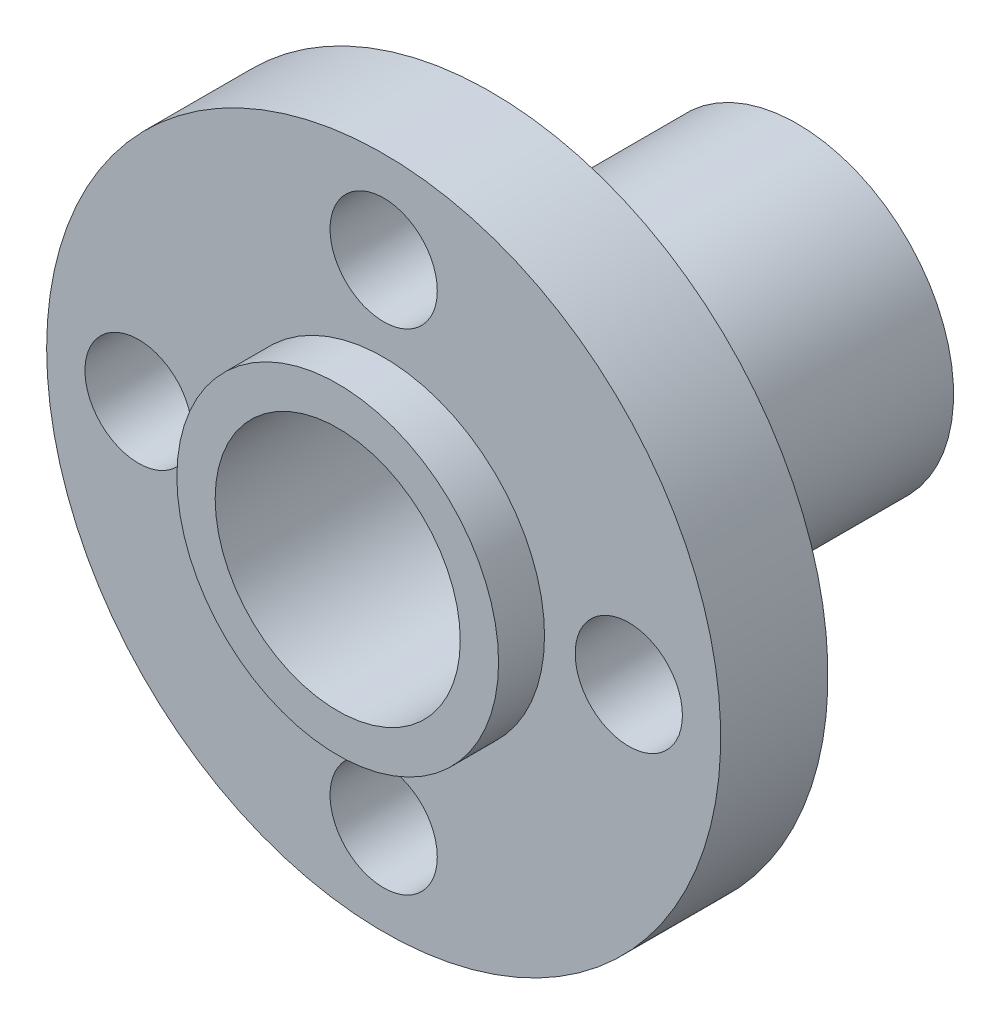
ISO-10303-21;
HEADER;
FILE_DESCRIPTION(('STEP AP214'),'2;1');
FILE_NAME('part.step','',(''),(''),'','','');
FILE_SCHEMA(('AUTOMOTIVE_DESIGN { 1 0 10303 214 1 1 1 1 }'));
ENDSEC;
DATA;
#1=APPLICATION_CONTEXT('core data for automotive mechanical design processes');
#2=APPLICATION_PROTOCOL_DEFINITION('international standard','automotive_design',2000,#1);
#3=PRODUCT_CONTEXT('',#1,'mechanical');
#4=PRODUCT('Part','Part','',(#3));
#5=PRODUCT_RELATED_PRODUCT_CATEGORY('part','',(#4));
#6=PRODUCT_DEFINITION_FORMATION('','',#4);
#7=PRODUCT_DEFINITION_CONTEXT('part definition',#1,'design');
#8=PRODUCT_DEFINITION('design','',#6,#7);
#9=PRODUCT_DEFINITION_SHAPE('','',#8);
#10=(LENGTH_UNIT() NAMED_UNIT(*) SI_UNIT(.MILLI.,.METRE.));
#11=(NAMED_UNIT(*) PLANE_ANGLE_UNIT() SI_UNIT($,.RADIAN.));
#12=(NAMED_UNIT(*) SI_UNIT($,.STERADIAN.) SOLID_ANGLE_UNIT());
#13=UNCERTAINTY_MEASURE_WITH_UNIT(LENGTH_MEASURE(1.E-05),#10,'distance_accuracy_value','');
#14=(GEOMETRIC_REPRESENTATION_CONTEXT(3) GLOBAL_UNCERTAINTY_ASSIGNED_CONTEXT((#13)) GLOBAL_UNIT_ASSIGNED_CONTEXT((#10,
#11,#12)) REPRESENTATION_CONTEXT('',''));
#15=CARTESIAN_POINT('',(0.,0.,0.));
#16=DIRECTION('',(0.,0.,1.));
#17=DIRECTION('',(1.,0.,0.));
#18=AXIS2_PLACEMENT_3D('',#15,#16,#17);
#19=CARTESIAN_POINT('',(0.,0.,-1.5));
#20=DIRECTION('',(0.,0.,1.));
#21=DIRECTION('',(1.,0.,0.));
#22=AXIS2_PLACEMENT_3D('',#19,#20,#21);
#23=CYLINDRICAL_SURFACE('',#22,5.25);
#24=CARTESIAN_POINT('',(0.,0.,-1.5));
#25=DIRECTION('',(0.,0.,1.));
#26=DIRECTION('',(1.,0.,0.));
#27=AXIS2_PLACEMENT_3D('',#24,#25,#26);
#28=CIRCLE('',#27,5.25);
#29=CARTESIAN_POINT('',(5.25,0.,-1.5));
#30=VERTEX_POINT('',#29);
#31=EDGE_CURVE('E47',#30,#30,#28,.T.);
#32=ORIENTED_EDGE('',*,*,#31,.T.);
#33=EDGE_LOOP('',(#32));
#34=FACE_BOUND('',#33,.T.);
#35=CARTESIAN_POINT('',(0.,0.,0.));
#36=DIRECTION('',(0.,0.,1.));
#37=DIRECTION('',(1.,0.,0.));
#38=AXIS2_PLACEMENT_3D('',#35,#36,#37);
#39=CIRCLE('',#38,5.25);
#40=CARTESIAN_POINT('',(5.25,0.,0.));
#41=VERTEX_POINT('',#40);
#42=EDGE_CURVE('E39',#41,#41,#39,.T.);
#43=ORIENTED_EDGE('',*,*,#42,.F.);
#44=EDGE_LOOP('',(#43));
#45=FACE_BOUND('',#44,.T.);
#46=ADVANCED_FACE('F36',(#34,#45),#23,.T.);
#47=CARTESIAN_POINT('',(0.,0.,0.));
#48=DIRECTION('',(0.,0.,1.));
#49=DIRECTION('',(1.,0.,0.));
#50=AXIS2_PLACEMENT_3D('',#47,#48,#49);
#51=PLANE('',#50);
#52=CARTESIAN_POINT('',(0.,0.,0.));
#53=DIRECTION('',(0.,0.,-1.));
#54=DIRECTION('',(-1.,0.,0.));
#55=AXIS2_PLACEMENT_3D('',#52,#53,#54);
#56=CIRCLE('',#55,4.);
#57=CARTESIAN_POINT('',(-4.,0.,0.));
#58=VERTEX_POINT('',#57);
#59=EDGE_CURVE('E180',#58,#58,#56,.T.);
#60=ORIENTED_EDGE('',*,*,#59,.T.);
#61=EDGE_LOOP('',(#60));
#62=FACE_BOUND('',#61,.T.);
#63=ORIENTED_EDGE('',*,*,#42,.T.);
#64=EDGE_LOOP('',(#63));
#65=FACE_BOUND('',#64,.T.);
#66=ADVANCED_FACE('F73',(#62,#65),#51,.T.);
#67=CARTESIAN_POINT('',(0.,0.,-5.));
#68=DIRECTION('',(0.,0.,1.));
#69=DIRECTION('',(1.,0.,0.));
#70=AXIS2_PLACEMENT_3D('',#67,#68,#69);
#71=CYLINDRICAL_SURFACE('',#70,11.);
#72=CARTESIAN_POINT('',(0.,0.,-5.));
#73=DIRECTION('',(0.,0.,-1.));
#74=DIRECTION('',(-1.,0.,0.));
#75=AXIS2_PLACEMENT_3D('',#72,#73,#74);
#76=CIRCLE('',#75,11.);
#77=CARTESIAN_POINT('',(-11.,0.,-5.));
#78=VERTEX_POINT('',#77);
#79=EDGE_CURVE('E52',#78,#78,#76,.T.);
#80=ORIENTED_EDGE('',*,*,#79,.F.);
#81=EDGE_LOOP('',(#80));
#82=FACE_BOUND('',#81,.T.);
#83=CARTESIAN_POINT('',(0.,0.,-1.5));
#84=DIRECTION('',(0.,0.,-1.));
#85=DIRECTION('',(-1.,0.,0.));
#86=AXIS2_PLACEMENT_3D('',#83,#84,#85);
#87=CIRCLE('',#86,11.);
#88=CARTESIAN_POINT('',(-11.,0.,-1.5));
#89=VERTEX_POINT('',#88);
#90=EDGE_CURVE('E55',#89,#89,#87,.T.);
#91=ORIENTED_EDGE('',*,*,#90,.T.);
#92=EDGE_LOOP('',(#91));
#93=FACE_BOUND('',#92,.T.);
#94=ADVANCED_FACE('F71',(#82,#93),#71,.T.);
#95=CARTESIAN_POINT('',(0.,0.,-5.));
#96=DIRECTION('',(0.,0.,-1.));
#97=DIRECTION('',(-1.,0.,0.));
#98=AXIS2_PLACEMENT_3D('',#95,#96,#97);
#99=PLANE('',#98);
#100=CARTESIAN_POINT('',(-8.,0.,-5.));
#101=DIRECTION('',(0.,0.,-1.));
#102=DIRECTION('',(-1.,0.,0.));
#103=AXIS2_PLACEMENT_3D('',#100,#101,#102);
#104=CIRCLE('',#103,1.75);
#105=CARTESIAN_POINT('',(-9.75,0.,-5.));
#106=VERTEX_POINT('',#105);
#107=EDGE_CURVE('E186',#106,#106,#104,.T.);
#108=ORIENTED_EDGE('',*,*,#107,.F.);
#109=EDGE_LOOP('',(#108));
#110=FACE_BOUND('',#109,.T.);
#111=CARTESIAN_POINT('',(0.,8.,-5.));
#112=DIRECTION('',(0.,0.,-1.));
#113=DIRECTION('',(-1.,0.,0.));
#114=AXIS2_PLACEMENT_3D('',#111,#112,#113);
#115=CIRCLE('',#114,1.75);
#116=CARTESIAN_POINT('',(-1.74999999999997,8.,-5.));
#117=VERTEX_POINT('',#116);
#118=EDGE_CURVE('E189',#117,#117,#115,.T.);
#119=ORIENTED_EDGE('',*,*,#118,.F.);
#120=EDGE_LOOP('',(#119));
#121=FACE_BOUND('',#120,.T.);
#122=CARTESIAN_POINT('',(8.,0.,-5.));
#123=DIRECTION('',(0.,0.,-1.));
#124=DIRECTION('',(-1.,0.,0.));
#125=AXIS2_PLACEMENT_3D('',#122,#123,#124);
#126=CIRCLE('',#125,1.75);
#127=CARTESIAN_POINT('',(6.25,0.,-5.));
#128=VERTEX_POINT('',#127);
#129=EDGE_CURVE('E192',#128,#128,#126,.T.);
#130=ORIENTED_EDGE('',*,*,#129,.F.);
#131=EDGE_LOOP('',(#130));
#132=FACE_BOUND('',#131,.T.);
#133=CARTESIAN_POINT('',(0.,-8.,-5.));
#134=DIRECTION('',(0.,0.,-1.));
#135=DIRECTION('',(-1.,0.,0.));
#136=AXIS2_PLACEMENT_3D('',#133,#134,#135);
#137=CIRCLE('',#136,1.75);
#138=CARTESIAN_POINT('',(-1.75000000000008,-8.,-5.));
#139=VERTEX_POINT('',#138);
#140=EDGE_CURVE('E195',#139,#139,#137,.T.);
#141=ORIENTED_EDGE('',*,*,#140,.F.);
#142=EDGE_LOOP('',(#141));
#143=FACE_BOUND('',#142,.T.);
#144=CARTESIAN_POINT('',(0.,0.,-5.));
#145=DIRECTION('',(0.,0.,-1.));
#146=DIRECTION('',(-1.,0.,0.));
#147=AXIS2_PLACEMENT_3D('',#144,#145,#146);
#148=CIRCLE('',#147,5.1);
#149=CARTESIAN_POINT('',(-5.1,0.,-5.));
#150=VERTEX_POINT('',#149);
#151=EDGE_CURVE('E10',#150,#150,#148,.T.);
#152=ORIENTED_EDGE('',*,*,#151,.F.);
#153=EDGE_LOOP('',(#152));
#154=FACE_BOUND('',#153,.T.);
#155=ORIENTED_EDGE('',*,*,#79,.T.);
#156=EDGE_LOOP('',(#155));
#157=FACE_BOUND('',#156,.T.);
#158=ADVANCED_FACE('F66',(#110,#121,#132,#143,#154,#157),#99,.T.);
#159=CARTESIAN_POINT('',(0.,0.,-1.5));
#160=DIRECTION('',(0.,0.,-1.));
#161=DIRECTION('',(-1.,0.,0.));
#162=AXIS2_PLACEMENT_3D('',#159,#160,#161);
#163=PLANE('',#162);
#164=CARTESIAN_POINT('',(-8.,0.,-1.5));
#165=DIRECTION('',(0.,0.,1.));
#166=DIRECTION('',(1.,0.,0.));
#167=AXIS2_PLACEMENT_3D('',#164,#165,#166);
#168=CIRCLE('',#167,1.75);
#169=CARTESIAN_POINT('',(-6.25,0.,-1.5));
#170=VERTEX_POINT('',#169);
#171=EDGE_CURVE('E198',#170,#170,#168,.T.);
#172=ORIENTED_EDGE('',*,*,#171,.F.);
#173=EDGE_LOOP('',(#172));
#174=FACE_BOUND('',#173,.T.);
#175=CARTESIAN_POINT('',(0.,8.,-1.5));
#176=DIRECTION('',(0.,0.,1.));
#177=DIRECTION('',(1.,0.,0.));
#178=AXIS2_PLACEMENT_3D('',#175,#176,#177);
#179=CIRCLE('',#178,1.75);
#180=CARTESIAN_POINT('',(1.75000000000003,8.,-1.5));
#181=VERTEX_POINT('',#180);
#182=EDGE_CURVE('E205',#181,#181,#179,.T.);
#183=ORIENTED_EDGE('',*,*,#182,.F.);
#184=EDGE_LOOP('',(#183));
#185=FACE_BOUND('',#184,.T.);
#186=CARTESIAN_POINT('',(8.,0.,-1.5));
#187=DIRECTION('',(0.,0.,1.));
#188=DIRECTION('',(1.,0.,0.));
#189=AXIS2_PLACEMENT_3D('',#186,#187,#188);
#190=CIRCLE('',#189,1.75);
#191=CARTESIAN_POINT('',(9.75,0.,-1.5));
#192=VERTEX_POINT('',#191);
#193=EDGE_CURVE('E202',#192,#192,#190,.T.);
#194=ORIENTED_EDGE('',*,*,#193,.F.);
#195=EDGE_LOOP('',(#194));
#196=FACE_BOUND('',#195,.T.);
#197=CARTESIAN_POINT('',(0.,-8.,-1.5));
#198=DIRECTION('',(0.,0.,1.));
#199=DIRECTION('',(1.,0.,0.));
#200=AXIS2_PLACEMENT_3D('',#197,#198,#199);
#201=CIRCLE('',#200,1.75);
#202=CARTESIAN_POINT('',(1.74999999999992,-8.,-1.5));
#203=VERTEX_POINT('',#202);
#204=EDGE_CURVE('E199',#203,#203,#201,.T.);
#205=ORIENTED_EDGE('',*,*,#204,.F.);
#206=EDGE_LOOP('',(#205));
#207=FACE_BOUND('',#206,.T.);
#208=ORIENTED_EDGE('',*,*,#31,.F.);
#209=EDGE_LOOP('',(#208));
#210=FACE_BOUND('',#209,.T.);
#211=ORIENTED_EDGE('',*,*,#90,.F.);
#212=EDGE_LOOP('',(#211));
#213=FACE_BOUND('',#212,.T.);
#214=ADVANCED_FACE('F62',(#174,#185,#196,#207,#210,#213),#163,.F.);
#215=CARTESIAN_POINT('',(0.,0.,-15.));
#216=DIRECTION('',(0.,0.,1.));
#217=DIRECTION('',(1.,0.,0.));
#218=AXIS2_PLACEMENT_3D('',#215,#216,#217);
#219=CYLINDRICAL_SURFACE('',#218,5.1);
#220=CARTESIAN_POINT('',(0.,0.,-15.));
#221=DIRECTION('',(0.,0.,-1.));
#222=DIRECTION('',(-1.,0.,0.));
#223=AXIS2_PLACEMENT_3D('',#220,#221,#222);
#224=CIRCLE('',#223,5.1);
#225=CARTESIAN_POINT('',(-5.1,0.,-15.));
#226=VERTEX_POINT('',#225);
#227=EDGE_CURVE('E50',#226,#226,#224,.T.);
#228=ORIENTED_EDGE('',*,*,#227,.F.);
#229=EDGE_LOOP('',(#228));
#230=FACE_BOUND('',#229,.T.);
#231=ORIENTED_EDGE('',*,*,#151,.T.);
#232=EDGE_LOOP('',(#231));
#233=FACE_BOUND('',#232,.T.);
#234=ADVANCED_FACE('F65',(#230,#233),#219,.T.);
#235=CARTESIAN_POINT('',(0.,0.,-15.));
#236=DIRECTION('',(0.,0.,-1.));
#237=DIRECTION('',(-1.,0.,0.));
#238=AXIS2_PLACEMENT_3D('',#235,#236,#237);
#239=PLANE('',#238);
#240=CARTESIAN_POINT('',(0.,0.,-15.));
#241=DIRECTION('',(0.,0.,-1.));
#242=DIRECTION('',(-1.,0.,0.));
#243=AXIS2_PLACEMENT_3D('',#240,#241,#242);
#244=CIRCLE('',#243,4.);
#245=CARTESIAN_POINT('',(-4.,0.,-15.));
#246=VERTEX_POINT('',#245);
#247=EDGE_CURVE('E182',#246,#246,#244,.T.);
#248=ORIENTED_EDGE('',*,*,#247,.F.);
#249=EDGE_LOOP('',(#248));
#250=FACE_BOUND('',#249,.T.);
#251=ORIENTED_EDGE('',*,*,#227,.T.);
#252=EDGE_LOOP('',(#251));
#253=FACE_BOUND('',#252,.T.);
#254=ADVANCED_FACE('F101',(#250,#253),#239,.T.);
#255=CARTESIAN_POINT('',(0.,0.,0.));
#256=DIRECTION('',(0.,0.,-1.));
#257=DIRECTION('',(-1.,0.,0.));
#258=AXIS2_PLACEMENT_3D('',#255,#256,#257);
#259=CYLINDRICAL_SURFACE('',#258,4.);
#260=ORIENTED_EDGE('',*,*,#59,.F.);
#261=EDGE_LOOP('',(#260));
#262=FACE_BOUND('',#261,.T.);
#263=ORIENTED_EDGE('',*,*,#247,.T.);
#264=EDGE_LOOP('',(#263));
#265=FACE_BOUND('',#264,.T.);
#266=ADVANCED_FACE('F106',(#262,#265),#259,.F.);
#267=CARTESIAN_POINT('',(0.,-8.,-11.5));
#268=DIRECTION('',(0.,0.,1.));
#269=DIRECTION('',(1.,0.,0.));
#270=AXIS2_PLACEMENT_3D('',#267,#268,#269);
#271=CYLINDRICAL_SURFACE('',#270,1.75);
#272=ORIENTED_EDGE('',*,*,#140,.T.);
#273=EDGE_LOOP('',(#272));
#274=FACE_BOUND('',#273,.T.);
#275=ORIENTED_EDGE('',*,*,#204,.T.);
#276=EDGE_LOOP('',(#275));
#277=FACE_BOUND('',#276,.T.);
#278=ADVANCED_FACE('F116',(#274,#277),#271,.F.);
#279=CARTESIAN_POINT('',(8.,0.,-11.5));
#280=DIRECTION('',(0.,0.,1.));
#281=DIRECTION('',(1.,0.,0.));
#282=AXIS2_PLACEMENT_3D('',#279,#280,#281);
#283=CYLINDRICAL_SURFACE('',#282,1.75);
#284=ORIENTED_EDGE('',*,*,#129,.T.);
#285=EDGE_LOOP('',(#284));
#286=FACE_BOUND('',#285,.T.);
#287=ORIENTED_EDGE('',*,*,#193,.T.);
#288=EDGE_LOOP('',(#287));
#289=FACE_BOUND('',#288,.T.);
#290=ADVANCED_FACE('F138',(#286,#289),#283,.F.);
#291=CARTESIAN_POINT('',(0.,8.,-11.5));
#292=DIRECTION('',(0.,0.,1.));
#293=DIRECTION('',(1.,0.,0.));
#294=AXIS2_PLACEMENT_3D('',#291,#292,#293);
#295=CYLINDRICAL_SURFACE('',#294,1.75);
#296=ORIENTED_EDGE('',*,*,#118,.T.);
#297=EDGE_LOOP('',(#296));
#298=FACE_BOUND('',#297,.T.);
#299=ORIENTED_EDGE('',*,*,#182,.T.);
#300=EDGE_LOOP('',(#299));
#301=FACE_BOUND('',#300,.T.);
#302=ADVANCED_FACE('F148',(#298,#301),#295,.F.);
#303=CARTESIAN_POINT('',(-8.,0.,-11.5));
#304=DIRECTION('',(0.,0.,1.));
#305=DIRECTION('',(1.,0.,0.));
#306=AXIS2_PLACEMENT_3D('',#303,#304,#305);
#307=CYLINDRICAL_SURFACE('',#306,1.75);
#308=ORIENTED_EDGE('',*,*,#107,.T.);
#309=EDGE_LOOP('',(#308));
#310=FACE_BOUND('',#309,.T.);
#311=ORIENTED_EDGE('',*,*,#171,.T.);
#312=EDGE_LOOP('',(#311));
#313=FACE_BOUND('',#312,.T.);
#314=ADVANCED_FACE('F158',(#310,#313),#307,.F.);
#315=CLOSED_SHELL('',(#46,#66,#94,#158,#214,#234,#254,#266,#278,#290,#302,#314));
#316=MANIFOLD_SOLID_BREP('B2',#315);
#317=ADVANCED_BREP_SHAPE_REPRESENTATION('',(#18,#316),#14);
#318=SHAPE_DEFINITION_REPRESENTATION(#9,#317);
ENDSEC;
END-ISO-10303-21;
